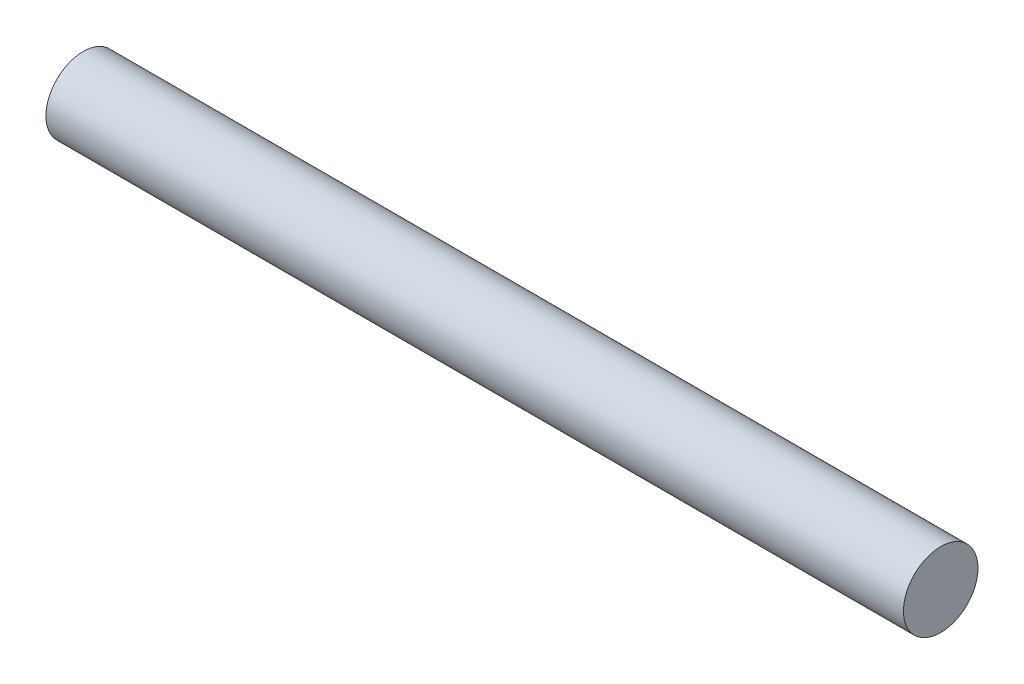
ISO-10303-21;
HEADER;
FILE_DESCRIPTION(('STEP AP214'),'2;1');
FILE_NAME('part.step','',(''),(''),'','','');
FILE_SCHEMA(('AUTOMOTIVE_DESIGN { 1 0 10303 214 1 1 1 1 }'));
ENDSEC;
DATA;
#1=APPLICATION_CONTEXT('core data for automotive mechanical design processes');
#2=APPLICATION_PROTOCOL_DEFINITION('international standard','automotive_design',2000,#1);
#3=PRODUCT_CONTEXT('',#1,'mechanical');
#4=PRODUCT('Part','Part','',(#3));
#5=PRODUCT_RELATED_PRODUCT_CATEGORY('part','',(#4));
#6=PRODUCT_DEFINITION_FORMATION('','',#4);
#7=PRODUCT_DEFINITION_CONTEXT('part definition',#1,'design');
#8=PRODUCT_DEFINITION('design','',#6,#7);
#9=PRODUCT_DEFINITION_SHAPE('','',#8);
#10=(LENGTH_UNIT() NAMED_UNIT(*) SI_UNIT(.MILLI.,.METRE.));
#11=(NAMED_UNIT(*) PLANE_ANGLE_UNIT() SI_UNIT($,.RADIAN.));
#12=(NAMED_UNIT(*) SI_UNIT($,.STERADIAN.) SOLID_ANGLE_UNIT());
#13=UNCERTAINTY_MEASURE_WITH_UNIT(LENGTH_MEASURE(1.E-05),#10,'distance_accuracy_value','');
#14=(GEOMETRIC_REPRESENTATION_CONTEXT(3) GLOBAL_UNCERTAINTY_ASSIGNED_CONTEXT((#13)) GLOBAL_UNIT_ASSIGNED_CONTEXT((#10,
#11,#12)) REPRESENTATION_CONTEXT('',''));
#15=CARTESIAN_POINT('',(0.,0.,0.));
#16=DIRECTION('',(0.,0.,1.));
#17=DIRECTION('',(1.,0.,0.));
#18=AXIS2_PLACEMENT_3D('',#15,#16,#17);
#19=CARTESIAN_POINT('',(23.,0.,0.));
#20=DIRECTION('',(-1.,0.,0.));
#21=DIRECTION('',(0.,0.,1.));
#22=AXIS2_PLACEMENT_3D('',#19,#20,#21);
#23=CYLINDRICAL_SURFACE('',#22,1.);
#24=CARTESIAN_POINT('',(23.,0.,0.));
#25=DIRECTION('',(1.,0.,0.));
#26=DIRECTION('',(0.,0.,-1.));
#27=AXIS2_PLACEMENT_3D('',#24,#25,#26);
#28=CIRCLE('',#27,1.);
#29=CARTESIAN_POINT('',(23.,0.,-1.));
#30=VERTEX_POINT('',#29);
#31=EDGE_CURVE('E10',#30,#30,#28,.T.);
#32=ORIENTED_EDGE('',*,*,#31,.F.);
#33=EDGE_LOOP('',(#32));
#34=FACE_BOUND('',#33,.T.);
#35=CARTESIAN_POINT('',(0.,0.,0.));
#36=DIRECTION('',(1.,0.,0.));
#37=DIRECTION('',(0.,0.,-1.));
#38=AXIS2_PLACEMENT_3D('',#35,#36,#37);
#39=CIRCLE('',#38,1.);
#40=CARTESIAN_POINT('',(0.,0.,-1.));
#41=VERTEX_POINT('',#40);
#42=EDGE_CURVE('E37',#41,#41,#39,.T.);
#43=ORIENTED_EDGE('',*,*,#42,.T.);
#44=EDGE_LOOP('',(#43));
#45=FACE_BOUND('',#44,.T.);
#46=ADVANCED_FACE('F34',(#34,#45),#23,.T.);
#47=CARTESIAN_POINT('',(23.,0.,0.));
#48=DIRECTION('',(1.,0.,0.));
#49=DIRECTION('',(0.,0.,-1.));
#50=AXIS2_PLACEMENT_3D('',#47,#48,#49);
#51=PLANE('',#50);
#52=ORIENTED_EDGE('',*,*,#31,.T.);
#53=EDGE_LOOP('',(#52));
#54=FACE_BOUND('',#53,.T.);
#55=ADVANCED_FACE('F49',(#54),#51,.T.);
#56=CARTESIAN_POINT('',(0.,0.,0.));
#57=DIRECTION('',(1.,0.,0.));
#58=DIRECTION('',(0.,0.,-1.));
#59=AXIS2_PLACEMENT_3D('',#56,#57,#58);
#60=PLANE('',#59);
#61=ORIENTED_EDGE('',*,*,#42,.F.);
#62=EDGE_LOOP('',(#61));
#63=FACE_BOUND('',#62,.T.);
#64=ADVANCED_FACE('F47',(#63),#60,.F.);
#65=CLOSED_SHELL('',(#46,#55,#64));
#66=MANIFOLD_SOLID_BREP('B2',#65);
#67=ADVANCED_BREP_SHAPE_REPRESENTATION('',(#18,#66),#14);
#68=SHAPE_DEFINITION_REPRESENTATION(#9,#67);
ENDSEC;
END-ISO-10303-21;
